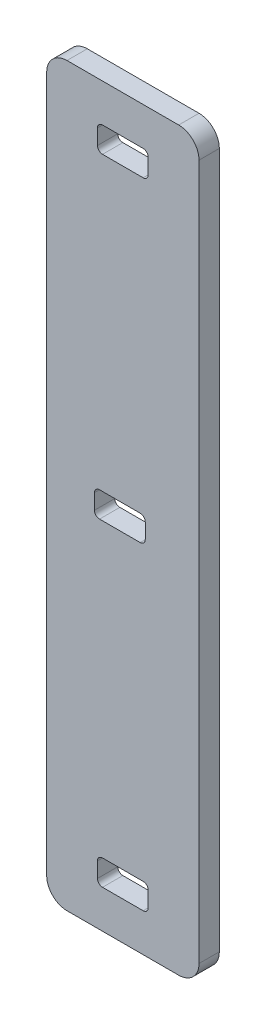
ISO-10303-21;
HEADER;
FILE_DESCRIPTION(('STEP AP214'),'2;1');
FILE_NAME('part.step','',(''),(''),'','','');
FILE_SCHEMA(('AUTOMOTIVE_DESIGN { 1 0 10303 214 1 1 1 1 }'));
ENDSEC;
DATA;
#1=APPLICATION_CONTEXT('core data for automotive mechanical design processes');
#2=APPLICATION_PROTOCOL_DEFINITION('international standard','automotive_design',2000,#1);
#3=PRODUCT_CONTEXT('',#1,'mechanical');
#4=PRODUCT('Part','Part','',(#3));
#5=PRODUCT_RELATED_PRODUCT_CATEGORY('part','',(#4));
#6=PRODUCT_DEFINITION_FORMATION('','',#4);
#7=PRODUCT_DEFINITION_CONTEXT('part definition',#1,'design');
#8=PRODUCT_DEFINITION('design','',#6,#7);
#9=PRODUCT_DEFINITION_SHAPE('','',#8);
#10=(LENGTH_UNIT() NAMED_UNIT(*) SI_UNIT(.MILLI.,.METRE.));
#11=(NAMED_UNIT(*) PLANE_ANGLE_UNIT() SI_UNIT($,.RADIAN.));
#12=(NAMED_UNIT(*) SI_UNIT($,.STERADIAN.) SOLID_ANGLE_UNIT());
#13=UNCERTAINTY_MEASURE_WITH_UNIT(LENGTH_MEASURE(1.E-05),#10,'distance_accuracy_value','');
#14=(GEOMETRIC_REPRESENTATION_CONTEXT(3) GLOBAL_UNCERTAINTY_ASSIGNED_CONTEXT((#13)) GLOBAL_UNIT_ASSIGNED_CONTEXT((#10,
#11,#12)) REPRESENTATION_CONTEXT('',''));
#15=CARTESIAN_POINT('',(0.,0.,0.));
#16=DIRECTION('',(0.,0.,1.));
#17=DIRECTION('',(1.,0.,0.));
#18=AXIS2_PLACEMENT_3D('',#15,#16,#17);
#19=CARTESIAN_POINT('',(-11.,-68.5,4.));
#20=DIRECTION('',(0.,0.,-1.));
#21=DIRECTION('',(-1.,0.,0.));
#22=AXIS2_PLACEMENT_3D('',#19,#20,#21);
#23=CYLINDRICAL_SURFACE('',#22,4.);
#24=CARTESIAN_POINT('',(-11.,-68.5,0.));
#25=DIRECTION('',(0.,0.,1.));
#26=DIRECTION('',(-1.,0.,0.));
#27=AXIS2_PLACEMENT_3D('',#24,#25,#26);
#28=CIRCLE('',#27,4.);
#29=CARTESIAN_POINT('',(-15.,-68.5,0.));
#30=VERTEX_POINT('',#29);
#31=CARTESIAN_POINT('',(-11.,-72.5,0.));
#32=VERTEX_POINT('',#31);
#33=EDGE_CURVE('E304',#30,#32,#28,.T.);
#34=ORIENTED_EDGE('',*,*,#33,.T.);
#35=DIRECTION('',(0.,0.,-1.));
#36=VECTOR('',#35,1.);
#37=CARTESIAN_POINT('',(-11.,-72.5,4.));
#38=LINE('',#37,#36);
#39=CARTESIAN_POINT('',(-11.,-72.5,4.));
#40=VERTEX_POINT('',#39);
#41=EDGE_CURVE('E11',#40,#32,#38,.T.);
#42=ORIENTED_EDGE('',*,*,#41,.F.);
#43=CARTESIAN_POINT('',(-11.,-68.5,4.));
#44=DIRECTION('',(0.,0.,1.));
#45=DIRECTION('',(-1.,0.,0.));
#46=AXIS2_PLACEMENT_3D('',#43,#44,#45);
#47=CIRCLE('',#46,4.);
#48=CARTESIAN_POINT('',(-15.,-68.5,4.));
#49=VERTEX_POINT('',#48);
#50=EDGE_CURVE('E441',#49,#40,#47,.T.);
#51=ORIENTED_EDGE('',*,*,#50,.F.);
#52=DIRECTION('',(0.,0.,-1.));
#53=VECTOR('',#52,1.);
#54=CARTESIAN_POINT('',(-15.,-68.5,4.));
#55=LINE('',#54,#53);
#56=EDGE_CURVE('E459',#49,#30,#55,.T.);
#57=ORIENTED_EDGE('',*,*,#56,.T.);
#58=EDGE_LOOP('',(#34,#42,#51,#57));
#59=FACE_BOUND('',#58,.T.);
#60=ADVANCED_FACE('F35',(#59),#23,.T.);
#61=CARTESIAN_POINT('',(-11.,-72.5,4.));
#62=DIRECTION('',(0.,1.,0.));
#63=DIRECTION('',(0.,0.,1.));
#64=AXIS2_PLACEMENT_3D('',#61,#62,#63);
#65=PLANE('',#64);
#66=DIRECTION('',(1.,0.,0.));
#67=VECTOR('',#66,1.);
#68=CARTESIAN_POINT('',(-11.,-72.5,0.));
#69=LINE('',#68,#67);
#70=CARTESIAN_POINT('',(11.,-72.5,0.));
#71=VERTEX_POINT('',#70);
#72=EDGE_CURVE('E462',#32,#71,#69,.T.);
#73=ORIENTED_EDGE('',*,*,#72,.T.);
#74=DIRECTION('',(0.,0.,-1.));
#75=VECTOR('',#74,1.);
#76=CARTESIAN_POINT('',(11.,-72.5,4.));
#77=LINE('',#76,#75);
#78=CARTESIAN_POINT('',(11.,-72.5,4.));
#79=VERTEX_POINT('',#78);
#80=EDGE_CURVE('E42',#79,#71,#77,.T.);
#81=ORIENTED_EDGE('',*,*,#80,.F.);
#82=DIRECTION('',(1.,0.,0.));
#83=VECTOR('',#82,1.);
#84=CARTESIAN_POINT('',(-11.,-72.5,4.));
#85=LINE('',#84,#83);
#86=EDGE_CURVE('E444',#40,#79,#85,.T.);
#87=ORIENTED_EDGE('',*,*,#86,.F.);
#88=ORIENTED_EDGE('',*,*,#41,.T.);
#89=EDGE_LOOP('',(#73,#81,#87,#88));
#90=FACE_BOUND('',#89,.T.);
#91=ADVANCED_FACE('F518',(#90),#65,.F.);
#92=CARTESIAN_POINT('',(11.,-68.5,4.));
#93=DIRECTION('',(0.,0.,-1.));
#94=DIRECTION('',(-1.,0.,0.));
#95=AXIS2_PLACEMENT_3D('',#92,#93,#94);
#96=CYLINDRICAL_SURFACE('',#95,4.);
#97=CARTESIAN_POINT('',(11.,-68.5,0.));
#98=DIRECTION('',(0.,0.,1.));
#99=DIRECTION('',(1.,0.,0.));
#100=AXIS2_PLACEMENT_3D('',#97,#98,#99);
#101=CIRCLE('',#100,4.);
#102=CARTESIAN_POINT('',(15.,-68.5,0.));
#103=VERTEX_POINT('',#102);
#104=EDGE_CURVE('E464',#71,#103,#101,.T.);
#105=ORIENTED_EDGE('',*,*,#104,.T.);
#106=DIRECTION('',(0.,0.,-1.));
#107=VECTOR('',#106,1.);
#108=CARTESIAN_POINT('',(15.,-68.5,4.));
#109=LINE('',#108,#107);
#110=CARTESIAN_POINT('',(15.,-68.5,4.));
#111=VERTEX_POINT('',#110);
#112=EDGE_CURVE('E489',#111,#103,#109,.T.);
#113=ORIENTED_EDGE('',*,*,#112,.F.);
#114=CARTESIAN_POINT('',(11.,-68.5,4.));
#115=DIRECTION('',(0.,0.,1.));
#116=DIRECTION('',(1.,0.,0.));
#117=AXIS2_PLACEMENT_3D('',#114,#115,#116);
#118=CIRCLE('',#117,4.);
#119=EDGE_CURVE('E447',#79,#111,#118,.T.);
#120=ORIENTED_EDGE('',*,*,#119,.F.);
#121=ORIENTED_EDGE('',*,*,#80,.T.);
#122=EDGE_LOOP('',(#105,#113,#120,#121));
#123=FACE_BOUND('',#122,.T.);
#124=ADVANCED_FACE('F496',(#123),#96,.T.);
#125=CARTESIAN_POINT('',(15.,-68.5,4.));
#126=DIRECTION('',(-1.,0.,0.));
#127=DIRECTION('',(0.,0.,1.));
#128=AXIS2_PLACEMENT_3D('',#125,#126,#127);
#129=PLANE('',#128);
#130=DIRECTION('',(0.,1.,0.));
#131=VECTOR('',#130,1.);
#132=CARTESIAN_POINT('',(15.,-68.5,0.));
#133=LINE('',#132,#131);
#134=CARTESIAN_POINT('',(15.,68.5,0.));
#135=VERTEX_POINT('',#134);
#136=EDGE_CURVE('E466',#103,#135,#133,.T.);
#137=ORIENTED_EDGE('',*,*,#136,.T.);
#138=DIRECTION('',(0.,0.,-1.));
#139=VECTOR('',#138,1.);
#140=CARTESIAN_POINT('',(15.,68.5,4.));
#141=LINE('',#140,#139);
#142=CARTESIAN_POINT('',(15.,68.5,4.));
#143=VERTEX_POINT('',#142);
#144=EDGE_CURVE('E486',#143,#135,#141,.T.);
#145=ORIENTED_EDGE('',*,*,#144,.F.);
#146=DIRECTION('',(0.,1.,0.));
#147=VECTOR('',#146,1.);
#148=CARTESIAN_POINT('',(15.,-68.5,4.));
#149=LINE('',#148,#147);
#150=EDGE_CURVE('E449',#111,#143,#149,.T.);
#151=ORIENTED_EDGE('',*,*,#150,.F.);
#152=ORIENTED_EDGE('',*,*,#112,.T.);
#153=EDGE_LOOP('',(#137,#145,#151,#152));
#154=FACE_BOUND('',#153,.T.);
#155=ADVANCED_FACE('F506',(#154),#129,.F.);
#156=CARTESIAN_POINT('',(11.,68.5,4.));
#157=DIRECTION('',(0.,0.,-1.));
#158=DIRECTION('',(-1.,0.,0.));
#159=AXIS2_PLACEMENT_3D('',#156,#157,#158);
#160=CYLINDRICAL_SURFACE('',#159,4.);
#161=CARTESIAN_POINT('',(11.,68.5,0.));
#162=DIRECTION('',(0.,0.,1.));
#163=DIRECTION('',(-1.,0.,0.));
#164=AXIS2_PLACEMENT_3D('',#161,#162,#163);
#165=CIRCLE('',#164,4.);
#166=CARTESIAN_POINT('',(11.,72.5,0.));
#167=VERTEX_POINT('',#166);
#168=EDGE_CURVE('E468',#135,#167,#165,.T.);
#169=ORIENTED_EDGE('',*,*,#168,.T.);
#170=DIRECTION('',(0.,0.,-1.));
#171=VECTOR('',#170,1.);
#172=CARTESIAN_POINT('',(11.,72.5,4.));
#173=LINE('',#172,#171);
#174=CARTESIAN_POINT('',(11.,72.5,4.));
#175=VERTEX_POINT('',#174);
#176=EDGE_CURVE('E483',#175,#167,#173,.T.);
#177=ORIENTED_EDGE('',*,*,#176,.F.);
#178=CARTESIAN_POINT('',(11.,68.5,4.));
#179=DIRECTION('',(0.,0.,1.));
#180=DIRECTION('',(-1.,0.,0.));
#181=AXIS2_PLACEMENT_3D('',#178,#179,#180);
#182=CIRCLE('',#181,4.);
#183=EDGE_CURVE('E451',#143,#175,#182,.T.);
#184=ORIENTED_EDGE('',*,*,#183,.F.);
#185=ORIENTED_EDGE('',*,*,#144,.T.);
#186=EDGE_LOOP('',(#169,#177,#184,#185));
#187=FACE_BOUND('',#186,.T.);
#188=ADVANCED_FACE('F510',(#187),#160,.T.);
#189=CARTESIAN_POINT('',(-11.,72.5,4.));
#190=DIRECTION('',(0.,-1.,0.));
#191=DIRECTION('',(0.,0.,-1.));
#192=AXIS2_PLACEMENT_3D('',#189,#190,#191);
#193=PLANE('',#192);
#194=DIRECTION('',(-1.,0.,0.));
#195=VECTOR('',#194,1.);
#196=CARTESIAN_POINT('',(-11.,72.5,0.));
#197=LINE('',#196,#195);
#198=CARTESIAN_POINT('',(-11.,72.5,0.));
#199=VERTEX_POINT('',#198);
#200=EDGE_CURVE('E470',#167,#199,#197,.T.);
#201=ORIENTED_EDGE('',*,*,#200,.T.);
#202=DIRECTION('',(0.,0.,-1.));
#203=VECTOR('',#202,1.);
#204=CARTESIAN_POINT('',(-11.,72.5,4.));
#205=LINE('',#204,#203);
#206=CARTESIAN_POINT('',(-11.,72.5,4.));
#207=VERTEX_POINT('',#206);
#208=EDGE_CURVE('E480',#207,#199,#205,.T.);
#209=ORIENTED_EDGE('',*,*,#208,.F.);
#210=DIRECTION('',(-1.,0.,0.));
#211=VECTOR('',#210,1.);
#212=CARTESIAN_POINT('',(-11.,72.5,4.));
#213=LINE('',#212,#211);
#214=EDGE_CURVE('E453',#175,#207,#213,.T.);
#215=ORIENTED_EDGE('',*,*,#214,.F.);
#216=ORIENTED_EDGE('',*,*,#176,.T.);
#217=EDGE_LOOP('',(#201,#209,#215,#216));
#218=FACE_BOUND('',#217,.T.);
#219=ADVANCED_FACE('F531',(#218),#193,.F.);
#220=CARTESIAN_POINT('',(-11.,68.5,4.));
#221=DIRECTION('',(0.,0.,-1.));
#222=DIRECTION('',(-1.,0.,0.));
#223=AXIS2_PLACEMENT_3D('',#220,#221,#222);
#224=CYLINDRICAL_SURFACE('',#223,4.);
#225=CARTESIAN_POINT('',(-11.,68.5,0.));
#226=DIRECTION('',(0.,0.,1.));
#227=DIRECTION('',(-1.,0.,0.));
#228=AXIS2_PLACEMENT_3D('',#225,#226,#227);
#229=CIRCLE('',#228,4.);
#230=CARTESIAN_POINT('',(-15.,68.5,0.));
#231=VERTEX_POINT('',#230);
#232=EDGE_CURVE('E472',#199,#231,#229,.T.);
#233=ORIENTED_EDGE('',*,*,#232,.T.);
#234=DIRECTION('',(0.,0.,-1.));
#235=VECTOR('',#234,1.);
#236=CARTESIAN_POINT('',(-15.,68.5,4.));
#237=LINE('',#236,#235);
#238=CARTESIAN_POINT('',(-15.,68.5,4.));
#239=VERTEX_POINT('',#238);
#240=EDGE_CURVE('E477',#239,#231,#237,.T.);
#241=ORIENTED_EDGE('',*,*,#240,.F.);
#242=CARTESIAN_POINT('',(-11.,68.5,4.));
#243=DIRECTION('',(0.,0.,1.));
#244=DIRECTION('',(-1.,0.,0.));
#245=AXIS2_PLACEMENT_3D('',#242,#243,#244);
#246=CIRCLE('',#245,4.);
#247=EDGE_CURVE('E455',#207,#239,#246,.T.);
#248=ORIENTED_EDGE('',*,*,#247,.F.);
#249=ORIENTED_EDGE('',*,*,#208,.T.);
#250=EDGE_LOOP('',(#233,#241,#248,#249));
#251=FACE_BOUND('',#250,.T.);
#252=ADVANCED_FACE('F529',(#251),#224,.T.);
#253=CARTESIAN_POINT('',(-15.,-68.5,4.));
#254=DIRECTION('',(1.,0.,0.));
#255=DIRECTION('',(0.,0.,-1.));
#256=AXIS2_PLACEMENT_3D('',#253,#254,#255);
#257=PLANE('',#256);
#258=DIRECTION('',(0.,-1.,0.));
#259=VECTOR('',#258,1.);
#260=CARTESIAN_POINT('',(-15.,-68.5,0.));
#261=LINE('',#260,#259);
#262=EDGE_CURVE('E445',#231,#30,#261,.T.);
#263=ORIENTED_EDGE('',*,*,#262,.T.);
#264=ORIENTED_EDGE('',*,*,#56,.F.);
#265=DIRECTION('',(0.,-1.,0.));
#266=VECTOR('',#265,1.);
#267=CARTESIAN_POINT('',(-15.,-68.5,4.));
#268=LINE('',#267,#266);
#269=EDGE_CURVE('E457',#239,#49,#268,.T.);
#270=ORIENTED_EDGE('',*,*,#269,.F.);
#271=ORIENTED_EDGE('',*,*,#240,.T.);
#272=EDGE_LOOP('',(#263,#264,#270,#271));
#273=FACE_BOUND('',#272,.T.);
#274=ADVANCED_FACE('F524',(#273),#257,.F.);
#275=CARTESIAN_POINT('',(-11.,-68.5,4.));
#276=DIRECTION('',(0.,0.,-1.));
#277=DIRECTION('',(-1.,0.,0.));
#278=AXIS2_PLACEMENT_3D('',#275,#276,#277);
#279=PLANE('',#278);
#280=DIRECTION('',(0.,-1.,0.));
#281=VECTOR('',#280,1.);
#282=CARTESIAN_POINT('',(-4.99999999999998,64.,4.));
#283=LINE('',#282,#281);
#284=CARTESIAN_POINT('',(-4.99999999999998,64.,4.));
#285=VERTEX_POINT('',#284);
#286=CARTESIAN_POINT('',(-4.99999999999998,61.,4.));
#287=VERTEX_POINT('',#286);
#288=EDGE_CURVE('E285',#285,#287,#283,.T.);
#289=ORIENTED_EDGE('',*,*,#288,.F.);
#290=CARTESIAN_POINT('',(-3.99999999999998,64.,4.));
#291=DIRECTION('',(0.,0.,1.));
#292=DIRECTION('',(1.,0.,0.));
#293=AXIS2_PLACEMENT_3D('',#290,#291,#292);
#294=CIRCLE('',#293,1.);
#295=CARTESIAN_POINT('',(-3.99999999999998,65.,4.));
#296=VERTEX_POINT('',#295);
#297=EDGE_CURVE('E49',#296,#285,#294,.T.);
#298=ORIENTED_EDGE('',*,*,#297,.F.);
#299=DIRECTION('',(-1.,0.,0.));
#300=VECTOR('',#299,1.);
#301=CARTESIAN_POINT('',(-3.99999999999998,65.,4.));
#302=LINE('',#301,#300);
#303=CARTESIAN_POINT('',(4.00000000000002,65.,4.));
#304=VERTEX_POINT('',#303);
#305=EDGE_CURVE('E265',#304,#296,#302,.T.);
#306=ORIENTED_EDGE('',*,*,#305,.F.);
#307=CARTESIAN_POINT('',(4.00000000000002,64.,4.));
#308=DIRECTION('',(0.,0.,1.));
#309=DIRECTION('',(-1.,0.,0.));
#310=AXIS2_PLACEMENT_3D('',#307,#308,#309);
#311=CIRCLE('',#310,1.);
#312=CARTESIAN_POINT('',(5.00000000000002,64.,4.));
#313=VERTEX_POINT('',#312);
#314=EDGE_CURVE('E268',#313,#304,#311,.T.);
#315=ORIENTED_EDGE('',*,*,#314,.F.);
#316=DIRECTION('',(0.,1.,0.));
#317=VECTOR('',#316,1.);
#318=CARTESIAN_POINT('',(5.00000000000002,64.,4.));
#319=LINE('',#318,#317);
#320=CARTESIAN_POINT('',(5.00000000000002,61.,4.));
#321=VERTEX_POINT('',#320);
#322=EDGE_CURVE('E297',#321,#313,#319,.T.);
#323=ORIENTED_EDGE('',*,*,#322,.F.);
#324=CARTESIAN_POINT('',(4.00000000000002,61.,4.));
#325=DIRECTION('',(0.,0.,1.));
#326=DIRECTION('',(1.,0.,0.));
#327=AXIS2_PLACEMENT_3D('',#324,#325,#326);
#328=CIRCLE('',#327,1.);
#329=CARTESIAN_POINT('',(4.00000000000002,60.,4.));
#330=VERTEX_POINT('',#329);
#331=EDGE_CURVE('E294',#330,#321,#328,.T.);
#332=ORIENTED_EDGE('',*,*,#331,.F.);
#333=DIRECTION('',(1.,0.,0.));
#334=VECTOR('',#333,1.);
#335=CARTESIAN_POINT('',(-3.99999999999998,60.,4.));
#336=LINE('',#335,#334);
#337=CARTESIAN_POINT('',(-3.99999999999998,60.,4.));
#338=VERTEX_POINT('',#337);
#339=EDGE_CURVE('E291',#338,#330,#336,.T.);
#340=ORIENTED_EDGE('',*,*,#339,.F.);
#341=CARTESIAN_POINT('',(-3.99999999999998,61.,4.));
#342=DIRECTION('',(0.,0.,1.));
#343=DIRECTION('',(1.,0.,0.));
#344=AXIS2_PLACEMENT_3D('',#341,#342,#343);
#345=CIRCLE('',#344,1.);
#346=EDGE_CURVE('E288',#287,#338,#345,.T.);
#347=ORIENTED_EDGE('',*,*,#346,.F.);
#348=EDGE_LOOP('',(#289,#298,#306,#315,#323,#332,#340,#347));
#349=FACE_BOUND('',#348,.T.);
#350=DIRECTION('',(0.,-1.,0.));
#351=VECTOR('',#350,1.);
#352=CARTESIAN_POINT('',(-5.00000000000003,-61.,4.));
#353=LINE('',#352,#351);
#354=CARTESIAN_POINT('',(-5.00000000000003,-61.,4.));
#355=VERTEX_POINT('',#354);
#356=CARTESIAN_POINT('',(-5.00000000000003,-64.,4.));
#357=VERTEX_POINT('',#356);
#358=EDGE_CURVE('E343',#355,#357,#353,.T.);
#359=ORIENTED_EDGE('',*,*,#358,.F.);
#360=CARTESIAN_POINT('',(-4.00000000000003,-61.,4.));
#361=DIRECTION('',(0.,0.,1.));
#362=DIRECTION('',(1.,0.,0.));
#363=AXIS2_PLACEMENT_3D('',#360,#361,#362);
#364=CIRCLE('',#363,1.);
#365=CARTESIAN_POINT('',(-4.00000000000003,-60.,4.));
#366=VERTEX_POINT('',#365);
#367=EDGE_CURVE('E57',#366,#355,#364,.T.);
#368=ORIENTED_EDGE('',*,*,#367,.F.);
#369=DIRECTION('',(-1.,0.,0.));
#370=VECTOR('',#369,1.);
#371=CARTESIAN_POINT('',(-4.00000000000003,-60.,4.));
#372=LINE('',#371,#370);
#373=CARTESIAN_POINT('',(3.99999999999997,-60.,4.));
#374=VERTEX_POINT('',#373);
#375=EDGE_CURVE('E320',#374,#366,#372,.T.);
#376=ORIENTED_EDGE('',*,*,#375,.F.);
#377=CARTESIAN_POINT('',(3.99999999999997,-61.,4.));
#378=DIRECTION('',(0.,0.,1.));
#379=DIRECTION('',(-1.,0.,0.));
#380=AXIS2_PLACEMENT_3D('',#377,#378,#379);
#381=CIRCLE('',#380,1.);
#382=CARTESIAN_POINT('',(4.99999999999997,-61.,4.));
#383=VERTEX_POINT('',#382);
#384=EDGE_CURVE('E359',#383,#374,#381,.T.);
#385=ORIENTED_EDGE('',*,*,#384,.F.);
#386=DIRECTION('',(0.,1.,0.));
#387=VECTOR('',#386,1.);
#388=CARTESIAN_POINT('',(4.99999999999997,-61.,4.));
#389=LINE('',#388,#387);
#390=CARTESIAN_POINT('',(4.99999999999997,-64.,4.));
#391=VERTEX_POINT('',#390);
#392=EDGE_CURVE('E356',#391,#383,#389,.T.);
#393=ORIENTED_EDGE('',*,*,#392,.F.);
#394=CARTESIAN_POINT('',(3.99999999999997,-64.,4.));
#395=DIRECTION('',(0.,0.,1.));
#396=DIRECTION('',(1.,0.,0.));
#397=AXIS2_PLACEMENT_3D('',#394,#395,#396);
#398=CIRCLE('',#397,1.);
#399=CARTESIAN_POINT('',(3.99999999999997,-65.,4.));
#400=VERTEX_POINT('',#399);
#401=EDGE_CURVE('E353',#400,#391,#398,.T.);
#402=ORIENTED_EDGE('',*,*,#401,.F.);
#403=DIRECTION('',(1.,0.,0.));
#404=VECTOR('',#403,1.);
#405=CARTESIAN_POINT('',(-4.00000000000003,-65.,4.));
#406=LINE('',#405,#404);
#407=CARTESIAN_POINT('',(-4.00000000000003,-65.,4.));
#408=VERTEX_POINT('',#407);
#409=EDGE_CURVE('E350',#408,#400,#406,.T.);
#410=ORIENTED_EDGE('',*,*,#409,.F.);
#411=CARTESIAN_POINT('',(-4.00000000000003,-64.,4.));
#412=DIRECTION('',(0.,0.,1.));
#413=DIRECTION('',(1.,0.,0.));
#414=AXIS2_PLACEMENT_3D('',#411,#412,#413);
#415=CIRCLE('',#414,1.);
#416=EDGE_CURVE('E347',#357,#408,#415,.T.);
#417=ORIENTED_EDGE('',*,*,#416,.F.);
#418=EDGE_LOOP('',(#359,#368,#376,#385,#393,#402,#410,#417));
#419=FACE_BOUND('',#418,.T.);
#420=DIRECTION('',(0.,-1.,0.));
#421=VECTOR('',#420,1.);
#422=CARTESIAN_POINT('',(-5.58762243909685,1.49999999999998,4.));
#423=LINE('',#422,#421);
#424=CARTESIAN_POINT('',(-5.58762243909685,1.49999999999999,4.));
#425=VERTEX_POINT('',#424);
#426=CARTESIAN_POINT('',(-5.58762243909685,-1.50000000000002,4.));
#427=VERTEX_POINT('',#426);
#428=EDGE_CURVE('E406',#425,#427,#423,.T.);
#429=ORIENTED_EDGE('',*,*,#428,.F.);
#430=CARTESIAN_POINT('',(-4.58762243909685,1.49999999999998,4.));
#431=DIRECTION('',(0.,0.,1.));
#432=DIRECTION('',(1.,0.,0.));
#433=AXIS2_PLACEMENT_3D('',#430,#431,#432);
#434=CIRCLE('',#433,1.);
#435=CARTESIAN_POINT('',(-4.58762243909685,2.49999999999998,4.));
#436=VERTEX_POINT('',#435);
#437=EDGE_CURVE('E404',#436,#425,#434,.T.);
#438=ORIENTED_EDGE('',*,*,#437,.F.);
#439=DIRECTION('',(-1.,0.,0.));
#440=VECTOR('',#439,1.);
#441=CARTESIAN_POINT('',(-4.58762243909685,2.49999999999998,4.));
#442=LINE('',#441,#440);
#443=CARTESIAN_POINT('',(3.41237756090315,2.49999999999998,4.));
#444=VERTEX_POINT('',#443);
#445=EDGE_CURVE('E382',#444,#436,#442,.T.);
#446=ORIENTED_EDGE('',*,*,#445,.F.);
#447=CARTESIAN_POINT('',(3.41237756090315,1.49999999999998,4.));
#448=DIRECTION('',(0.,0.,1.));
#449=DIRECTION('',(-1.,0.,0.));
#450=AXIS2_PLACEMENT_3D('',#447,#448,#449);
#451=CIRCLE('',#450,1.);
#452=CARTESIAN_POINT('',(4.41237756090315,1.49999999999998,4.));
#453=VERTEX_POINT('',#452);
#454=EDGE_CURVE('E421',#453,#444,#451,.T.);
#455=ORIENTED_EDGE('',*,*,#454,.F.);
#456=DIRECTION('',(0.,1.,0.));
#457=VECTOR('',#456,1.);
#458=CARTESIAN_POINT('',(4.41237756090315,1.49999999999998,4.));
#459=LINE('',#458,#457);
#460=CARTESIAN_POINT('',(4.41237756090315,-1.50000000000002,4.));
#461=VERTEX_POINT('',#460);
#462=EDGE_CURVE('E418',#461,#453,#459,.T.);
#463=ORIENTED_EDGE('',*,*,#462,.F.);
#464=CARTESIAN_POINT('',(3.41237756090315,-1.50000000000002,4.));
#465=DIRECTION('',(0.,0.,1.));
#466=DIRECTION('',(1.,0.,0.));
#467=AXIS2_PLACEMENT_3D('',#464,#465,#466);
#468=CIRCLE('',#467,1.);
#469=CARTESIAN_POINT('',(3.41237756090315,-2.50000000000002,4.));
#470=VERTEX_POINT('',#469);
#471=EDGE_CURVE('E415',#470,#461,#468,.T.);
#472=ORIENTED_EDGE('',*,*,#471,.F.);
#473=DIRECTION('',(1.,0.,0.));
#474=VECTOR('',#473,1.);
#475=CARTESIAN_POINT('',(-4.58762243909685,-2.50000000000002,4.));
#476=LINE('',#475,#474);
#477=CARTESIAN_POINT('',(-4.58762243909685,-2.50000000000002,4.));
#478=VERTEX_POINT('',#477);
#479=EDGE_CURVE('E412',#478,#470,#476,.T.);
#480=ORIENTED_EDGE('',*,*,#479,.F.);
#481=CARTESIAN_POINT('',(-4.58762243909685,-1.50000000000002,4.));
#482=DIRECTION('',(0.,0.,1.));
#483=DIRECTION('',(1.,0.,0.));
#484=AXIS2_PLACEMENT_3D('',#481,#482,#483);
#485=CIRCLE('',#484,0.999999999999999);
#486=EDGE_CURVE('E409',#427,#478,#485,.T.);
#487=ORIENTED_EDGE('',*,*,#486,.F.);
#488=EDGE_LOOP('',(#429,#438,#446,#455,#463,#472,#480,#487));
#489=FACE_BOUND('',#488,.T.);
#490=ORIENTED_EDGE('',*,*,#50,.T.);
#491=ORIENTED_EDGE('',*,*,#86,.T.);
#492=ORIENTED_EDGE('',*,*,#119,.T.);
#493=ORIENTED_EDGE('',*,*,#150,.T.);
#494=ORIENTED_EDGE('',*,*,#183,.T.);
#495=ORIENTED_EDGE('',*,*,#214,.T.);
#496=ORIENTED_EDGE('',*,*,#247,.T.);
#497=ORIENTED_EDGE('',*,*,#269,.T.);
#498=EDGE_LOOP('',(#490,#491,#492,#493,#494,#495,#496,#497));
#499=FACE_BOUND('',#498,.T.);
#500=ADVANCED_FACE('F514',(#349,#419,#489,#499),#279,.F.);
#501=CARTESIAN_POINT('',(-11.,-68.5,0.));
#502=DIRECTION('',(0.,0.,-1.));
#503=DIRECTION('',(-1.,0.,0.));
#504=AXIS2_PLACEMENT_3D('',#501,#502,#503);
#505=PLANE('',#504);
#506=CARTESIAN_POINT('',(-3.99999999999998,64.,0.));
#507=DIRECTION('',(0.,0.,1.));
#508=DIRECTION('',(1.,0.,0.));
#509=AXIS2_PLACEMENT_3D('',#506,#507,#508);
#510=CIRCLE('',#509,1.);
#511=CARTESIAN_POINT('',(-3.99999999999998,65.,0.));
#512=VERTEX_POINT('',#511);
#513=CARTESIAN_POINT('',(-4.99999999999998,64.,0.));
#514=VERTEX_POINT('',#513);
#515=EDGE_CURVE('E245',#512,#514,#510,.T.);
#516=ORIENTED_EDGE('',*,*,#515,.T.);
#517=DIRECTION('',(0.,-1.,0.));
#518=VECTOR('',#517,1.);
#519=CARTESIAN_POINT('',(-4.99999999999998,64.,0.));
#520=LINE('',#519,#518);
#521=CARTESIAN_POINT('',(-4.99999999999998,61.,0.));
#522=VERTEX_POINT('',#521);
#523=EDGE_CURVE('E255',#514,#522,#520,.T.);
#524=ORIENTED_EDGE('',*,*,#523,.T.);
#525=CARTESIAN_POINT('',(-3.99999999999998,61.,0.));
#526=DIRECTION('',(0.,0.,1.));
#527=DIRECTION('',(1.,0.,0.));
#528=AXIS2_PLACEMENT_3D('',#525,#526,#527);
#529=CIRCLE('',#528,1.);
#530=CARTESIAN_POINT('',(-3.99999999999998,60.,0.));
#531=VERTEX_POINT('',#530);
#532=EDGE_CURVE('E259',#522,#531,#529,.T.);
#533=ORIENTED_EDGE('',*,*,#532,.T.);
#534=DIRECTION('',(1.,0.,0.));
#535=VECTOR('',#534,1.);
#536=CARTESIAN_POINT('',(-3.99999999999998,60.,0.));
#537=LINE('',#536,#535);
#538=CARTESIAN_POINT('',(4.00000000000002,60.,0.));
#539=VERTEX_POINT('',#538);
#540=EDGE_CURVE('E272',#531,#539,#537,.T.);
#541=ORIENTED_EDGE('',*,*,#540,.T.);
#542=CARTESIAN_POINT('',(4.00000000000002,61.,0.));
#543=DIRECTION('',(0.,0.,1.));
#544=DIRECTION('',(1.,0.,0.));
#545=AXIS2_PLACEMENT_3D('',#542,#543,#544);
#546=CIRCLE('',#545,1.);
#547=CARTESIAN_POINT('',(5.00000000000002,61.,0.));
#548=VERTEX_POINT('',#547);
#549=EDGE_CURVE('E275',#539,#548,#546,.T.);
#550=ORIENTED_EDGE('',*,*,#549,.T.);
#551=DIRECTION('',(0.,1.,0.));
#552=VECTOR('',#551,1.);
#553=CARTESIAN_POINT('',(5.00000000000002,64.,0.));
#554=LINE('',#553,#552);
#555=CARTESIAN_POINT('',(5.00000000000002,64.,0.));
#556=VERTEX_POINT('',#555);
#557=EDGE_CURVE('E278',#548,#556,#554,.T.);
#558=ORIENTED_EDGE('',*,*,#557,.T.);
#559=CARTESIAN_POINT('',(4.00000000000002,64.,0.));
#560=DIRECTION('',(0.,0.,1.));
#561=DIRECTION('',(-1.,0.,0.));
#562=AXIS2_PLACEMENT_3D('',#559,#560,#561);
#563=CIRCLE('',#562,1.);
#564=CARTESIAN_POINT('',(4.00000000000002,65.,0.));
#565=VERTEX_POINT('',#564);
#566=EDGE_CURVE('E281',#556,#565,#563,.T.);
#567=ORIENTED_EDGE('',*,*,#566,.T.);
#568=DIRECTION('',(-1.,0.,0.));
#569=VECTOR('',#568,1.);
#570=CARTESIAN_POINT('',(-3.99999999999998,65.,0.));
#571=LINE('',#570,#569);
#572=EDGE_CURVE('E251',#565,#512,#571,.T.);
#573=ORIENTED_EDGE('',*,*,#572,.T.);
#574=EDGE_LOOP('',(#516,#524,#533,#541,#550,#558,#567,#573));
#575=FACE_BOUND('',#574,.T.);
#576=CARTESIAN_POINT('',(-4.00000000000003,-61.,0.));
#577=DIRECTION('',(0.,0.,1.));
#578=DIRECTION('',(1.,0.,0.));
#579=AXIS2_PLACEMENT_3D('',#576,#577,#578);
#580=CIRCLE('',#579,1.);
#581=CARTESIAN_POINT('',(-4.00000000000003,-60.,0.));
#582=VERTEX_POINT('',#581);
#583=CARTESIAN_POINT('',(-5.00000000000003,-61.,0.));
#584=VERTEX_POINT('',#583);
#585=EDGE_CURVE('E316',#582,#584,#580,.T.);
#586=ORIENTED_EDGE('',*,*,#585,.T.);
#587=DIRECTION('',(0.,-1.,0.));
#588=VECTOR('',#587,1.);
#589=CARTESIAN_POINT('',(-5.00000000000003,-61.,0.));
#590=LINE('',#589,#588);
#591=CARTESIAN_POINT('',(-5.00000000000003,-64.,0.));
#592=VERTEX_POINT('',#591);
#593=EDGE_CURVE('E319',#584,#592,#590,.T.);
#594=ORIENTED_EDGE('',*,*,#593,.T.);
#595=CARTESIAN_POINT('',(-4.00000000000003,-64.,0.));
#596=DIRECTION('',(0.,0.,1.));
#597=DIRECTION('',(1.,0.,0.));
#598=AXIS2_PLACEMENT_3D('',#595,#596,#597);
#599=CIRCLE('',#598,1.);
#600=CARTESIAN_POINT('',(-4.00000000000003,-65.,0.));
#601=VERTEX_POINT('',#600);
#602=EDGE_CURVE('E323',#592,#601,#599,.T.);
#603=ORIENTED_EDGE('',*,*,#602,.T.);
#604=DIRECTION('',(1.,0.,0.));
#605=VECTOR('',#604,1.);
#606=CARTESIAN_POINT('',(-4.00000000000003,-65.,0.));
#607=LINE('',#606,#605);
#608=CARTESIAN_POINT('',(3.99999999999997,-65.,0.));
#609=VERTEX_POINT('',#608);
#610=EDGE_CURVE('E326',#601,#609,#607,.T.);
#611=ORIENTED_EDGE('',*,*,#610,.T.);
#612=CARTESIAN_POINT('',(3.99999999999997,-64.,0.));
#613=DIRECTION('',(0.,0.,1.));
#614=DIRECTION('',(1.,0.,0.));
#615=AXIS2_PLACEMENT_3D('',#612,#613,#614);
#616=CIRCLE('',#615,1.);
#617=CARTESIAN_POINT('',(4.99999999999997,-64.,0.));
#618=VERTEX_POINT('',#617);
#619=EDGE_CURVE('E329',#609,#618,#616,.T.);
#620=ORIENTED_EDGE('',*,*,#619,.T.);
#621=DIRECTION('',(0.,1.,0.));
#622=VECTOR('',#621,1.);
#623=CARTESIAN_POINT('',(4.99999999999997,-61.,0.));
#624=LINE('',#623,#622);
#625=CARTESIAN_POINT('',(4.99999999999997,-61.,0.));
#626=VERTEX_POINT('',#625);
#627=EDGE_CURVE('E332',#618,#626,#624,.T.);
#628=ORIENTED_EDGE('',*,*,#627,.T.);
#629=CARTESIAN_POINT('',(3.99999999999997,-61.,0.));
#630=DIRECTION('',(0.,0.,1.));
#631=DIRECTION('',(-1.,0.,0.));
#632=AXIS2_PLACEMENT_3D('',#629,#630,#631);
#633=CIRCLE('',#632,1.);
#634=CARTESIAN_POINT('',(3.99999999999997,-60.,0.));
#635=VERTEX_POINT('',#634);
#636=EDGE_CURVE('E335',#626,#635,#633,.T.);
#637=ORIENTED_EDGE('',*,*,#636,.T.);
#638=DIRECTION('',(-1.,0.,0.));
#639=VECTOR('',#638,1.);
#640=CARTESIAN_POINT('',(-4.00000000000003,-60.,0.));
#641=LINE('',#640,#639);
#642=EDGE_CURVE('E338',#635,#582,#641,.T.);
#643=ORIENTED_EDGE('',*,*,#642,.T.);
#644=EDGE_LOOP('',(#586,#594,#603,#611,#620,#628,#637,#643));
#645=FACE_BOUND('',#644,.T.);
#646=CARTESIAN_POINT('',(-4.58762243909685,1.49999999999998,0.));
#647=DIRECTION('',(0.,0.,1.));
#648=DIRECTION('',(1.,0.,0.));
#649=AXIS2_PLACEMENT_3D('',#646,#647,#648);
#650=CIRCLE('',#649,1.);
#651=CARTESIAN_POINT('',(-4.58762243909685,2.49999999999998,0.));
#652=VERTEX_POINT('',#651);
#653=CARTESIAN_POINT('',(-5.58762243909685,1.49999999999998,0.));
#654=VERTEX_POINT('',#653);
#655=EDGE_CURVE('E378',#652,#654,#650,.T.);
#656=ORIENTED_EDGE('',*,*,#655,.T.);
#657=DIRECTION('',(0.,-1.,0.));
#658=VECTOR('',#657,1.);
#659=CARTESIAN_POINT('',(-5.58762243909685,1.49999999999998,0.));
#660=LINE('',#659,#658);
#661=CARTESIAN_POINT('',(-5.58762243909685,-1.50000000000002,0.));
#662=VERTEX_POINT('',#661);
#663=EDGE_CURVE('E381',#654,#662,#660,.T.);
#664=ORIENTED_EDGE('',*,*,#663,.T.);
#665=CARTESIAN_POINT('',(-4.58762243909685,-1.50000000000002,0.));
#666=DIRECTION('',(0.,0.,1.));
#667=DIRECTION('',(1.,0.,0.));
#668=AXIS2_PLACEMENT_3D('',#665,#666,#667);
#669=CIRCLE('',#668,0.999999999999999);
#670=CARTESIAN_POINT('',(-4.58762243909685,-2.50000000000002,0.));
#671=VERTEX_POINT('',#670);
#672=EDGE_CURVE('E385',#662,#671,#669,.T.);
#673=ORIENTED_EDGE('',*,*,#672,.T.);
#674=DIRECTION('',(1.,0.,0.));
#675=VECTOR('',#674,1.);
#676=CARTESIAN_POINT('',(-4.58762243909685,-2.50000000000002,0.));
#677=LINE('',#676,#675);
#678=CARTESIAN_POINT('',(3.41237756090315,-2.50000000000002,0.));
#679=VERTEX_POINT('',#678);
#680=EDGE_CURVE('E388',#671,#679,#677,.T.);
#681=ORIENTED_EDGE('',*,*,#680,.T.);
#682=CARTESIAN_POINT('',(3.41237756090315,-1.50000000000002,0.));
#683=DIRECTION('',(0.,0.,1.));
#684=DIRECTION('',(1.,0.,0.));
#685=AXIS2_PLACEMENT_3D('',#682,#683,#684);
#686=CIRCLE('',#685,1.);
#687=CARTESIAN_POINT('',(4.41237756090315,-1.50000000000002,0.));
#688=VERTEX_POINT('',#687);
#689=EDGE_CURVE('E391',#679,#688,#686,.T.);
#690=ORIENTED_EDGE('',*,*,#689,.T.);
#691=DIRECTION('',(0.,1.,0.));
#692=VECTOR('',#691,1.);
#693=CARTESIAN_POINT('',(4.41237756090315,1.49999999999998,0.));
#694=LINE('',#693,#692);
#695=CARTESIAN_POINT('',(4.41237756090315,1.49999999999998,0.));
#696=VERTEX_POINT('',#695);
#697=EDGE_CURVE('E394',#688,#696,#694,.T.);
#698=ORIENTED_EDGE('',*,*,#697,.T.);
#699=CARTESIAN_POINT('',(3.41237756090315,1.49999999999998,0.));
#700=DIRECTION('',(0.,0.,1.));
#701=DIRECTION('',(-1.,0.,0.));
#702=AXIS2_PLACEMENT_3D('',#699,#700,#701);
#703=CIRCLE('',#702,1.);
#704=CARTESIAN_POINT('',(3.41237756090315,2.49999999999998,0.));
#705=VERTEX_POINT('',#704);
#706=EDGE_CURVE('E397',#696,#705,#703,.T.);
#707=ORIENTED_EDGE('',*,*,#706,.T.);
#708=DIRECTION('',(-1.,0.,0.));
#709=VECTOR('',#708,1.);
#710=CARTESIAN_POINT('',(-4.58762243909685,2.49999999999998,0.));
#711=LINE('',#710,#709);
#712=EDGE_CURVE('E400',#705,#652,#711,.T.);
#713=ORIENTED_EDGE('',*,*,#712,.T.);
#714=EDGE_LOOP('',(#656,#664,#673,#681,#690,#698,#707,#713));
#715=FACE_BOUND('',#714,.T.);
#716=ORIENTED_EDGE('',*,*,#33,.F.);
#717=ORIENTED_EDGE('',*,*,#262,.F.);
#718=ORIENTED_EDGE('',*,*,#232,.F.);
#719=ORIENTED_EDGE('',*,*,#200,.F.);
#720=ORIENTED_EDGE('',*,*,#168,.F.);
#721=ORIENTED_EDGE('',*,*,#136,.F.);
#722=ORIENTED_EDGE('',*,*,#104,.F.);
#723=ORIENTED_EDGE('',*,*,#72,.F.);
#724=EDGE_LOOP('',(#716,#717,#718,#719,#720,#721,#722,#723));
#725=FACE_BOUND('',#724,.T.);
#726=ADVANCED_FACE('F261',(#575,#645,#715,#725),#505,.T.);
#727=CARTESIAN_POINT('',(-4.58762243909685,1.49999999999998,0.));
#728=DIRECTION('',(0.,0.,1.));
#729=DIRECTION('',(1.,0.,0.));
#730=AXIS2_PLACEMENT_3D('',#727,#728,#729);
#731=CYLINDRICAL_SURFACE('',#730,1.);
#732=ORIENTED_EDGE('',*,*,#437,.T.);
#733=DIRECTION('',(0.,0.,1.));
#734=VECTOR('',#733,1.);
#735=CARTESIAN_POINT('',(-5.58762243909685,1.49999999999998,0.));
#736=LINE('',#735,#734);
#737=EDGE_CURVE('E403',#654,#425,#736,.T.);
#738=ORIENTED_EDGE('',*,*,#737,.F.);
#739=ORIENTED_EDGE('',*,*,#655,.F.);
#740=DIRECTION('',(0.,0.,1.));
#741=VECTOR('',#740,1.);
#742=CARTESIAN_POINT('',(-4.58762243909685,2.49999999999998,0.));
#743=LINE('',#742,#741);
#744=EDGE_CURVE('E344',#652,#436,#743,.T.);
#745=ORIENTED_EDGE('',*,*,#744,.T.);
#746=EDGE_LOOP('',(#732,#738,#739,#745));
#747=FACE_BOUND('',#746,.T.);
#748=ADVANCED_FACE('F594',(#747),#731,.F.);
#749=CARTESIAN_POINT('',(-4.58762243909685,2.49999999999998,0.));
#750=DIRECTION('',(0.,1.,0.));
#751=DIRECTION('',(0.,0.,1.));
#752=AXIS2_PLACEMENT_3D('',#749,#750,#751);
#753=PLANE('',#752);
#754=ORIENTED_EDGE('',*,*,#445,.T.);
#755=ORIENTED_EDGE('',*,*,#744,.F.);
#756=ORIENTED_EDGE('',*,*,#712,.F.);
#757=DIRECTION('',(0.,0.,1.));
#758=VECTOR('',#757,1.);
#759=CARTESIAN_POINT('',(3.41237756090315,2.49999999999998,0.));
#760=LINE('',#759,#758);
#761=EDGE_CURVE('E427',#705,#444,#760,.T.);
#762=ORIENTED_EDGE('',*,*,#761,.T.);
#763=EDGE_LOOP('',(#754,#755,#756,#762));
#764=FACE_BOUND('',#763,.T.);
#765=ADVANCED_FACE('F603',(#764),#753,.F.);
#766=CARTESIAN_POINT('',(3.41237756090315,1.49999999999998,0.));
#767=DIRECTION('',(0.,0.,1.));
#768=DIRECTION('',(1.,0.,0.));
#769=AXIS2_PLACEMENT_3D('',#766,#767,#768);
#770=CYLINDRICAL_SURFACE('',#769,1.);
#771=ORIENTED_EDGE('',*,*,#454,.T.);
#772=ORIENTED_EDGE('',*,*,#761,.F.);
#773=ORIENTED_EDGE('',*,*,#706,.F.);
#774=DIRECTION('',(0.,0.,1.));
#775=VECTOR('',#774,1.);
#776=CARTESIAN_POINT('',(4.41237756090315,1.49999999999998,0.));
#777=LINE('',#776,#775);
#778=EDGE_CURVE('E429',#696,#453,#777,.T.);
#779=ORIENTED_EDGE('',*,*,#778,.T.);
#780=EDGE_LOOP('',(#771,#772,#773,#779));
#781=FACE_BOUND('',#780,.T.);
#782=ADVANCED_FACE('F613',(#781),#770,.F.);
#783=CARTESIAN_POINT('',(4.41237756090315,1.49999999999998,0.));
#784=DIRECTION('',(1.,0.,0.));
#785=DIRECTION('',(0.,0.,-1.));
#786=AXIS2_PLACEMENT_3D('',#783,#784,#785);
#787=PLANE('',#786);
#788=ORIENTED_EDGE('',*,*,#462,.T.);
#789=ORIENTED_EDGE('',*,*,#778,.F.);
#790=ORIENTED_EDGE('',*,*,#697,.F.);
#791=DIRECTION('',(0.,0.,1.));
#792=VECTOR('',#791,1.);
#793=CARTESIAN_POINT('',(4.41237756090315,-1.50000000000002,0.));
#794=LINE('',#793,#792);
#795=EDGE_CURVE('E431',#688,#461,#794,.T.);
#796=ORIENTED_EDGE('',*,*,#795,.T.);
#797=EDGE_LOOP('',(#788,#789,#790,#796));
#798=FACE_BOUND('',#797,.T.);
#799=ADVANCED_FACE('F623',(#798),#787,.F.);
#800=CARTESIAN_POINT('',(3.41237756090315,-1.50000000000002,0.));
#801=DIRECTION('',(0.,0.,1.));
#802=DIRECTION('',(1.,0.,0.));
#803=AXIS2_PLACEMENT_3D('',#800,#801,#802);
#804=CYLINDRICAL_SURFACE('',#803,1.);
#805=ORIENTED_EDGE('',*,*,#471,.T.);
#806=ORIENTED_EDGE('',*,*,#795,.F.);
#807=ORIENTED_EDGE('',*,*,#689,.F.);
#808=DIRECTION('',(0.,0.,1.));
#809=VECTOR('',#808,1.);
#810=CARTESIAN_POINT('',(3.41237756090315,-2.50000000000002,0.));
#811=LINE('',#810,#809);
#812=EDGE_CURVE('E433',#679,#470,#811,.T.);
#813=ORIENTED_EDGE('',*,*,#812,.T.);
#814=EDGE_LOOP('',(#805,#806,#807,#813));
#815=FACE_BOUND('',#814,.T.);
#816=ADVANCED_FACE('F633',(#815),#804,.F.);
#817=CARTESIAN_POINT('',(-4.58762243909685,-2.50000000000002,0.));
#818=DIRECTION('',(0.,-1.,0.));
#819=DIRECTION('',(0.,0.,-1.));
#820=AXIS2_PLACEMENT_3D('',#817,#818,#819);
#821=PLANE('',#820);
#822=ORIENTED_EDGE('',*,*,#479,.T.);
#823=ORIENTED_EDGE('',*,*,#812,.F.);
#824=ORIENTED_EDGE('',*,*,#680,.F.);
#825=DIRECTION('',(0.,0.,1.));
#826=VECTOR('',#825,1.);
#827=CARTESIAN_POINT('',(-4.58762243909685,-2.50000000000002,0.));
#828=LINE('',#827,#826);
#829=EDGE_CURVE('E435',#671,#478,#828,.T.);
#830=ORIENTED_EDGE('',*,*,#829,.T.);
#831=EDGE_LOOP('',(#822,#823,#824,#830));
#832=FACE_BOUND('',#831,.T.);
#833=ADVANCED_FACE('F643',(#832),#821,.F.);
#834=CARTESIAN_POINT('',(-4.58762243909685,-1.50000000000002,0.));
#835=DIRECTION('',(0.,0.,1.));
#836=DIRECTION('',(1.,0.,0.));
#837=AXIS2_PLACEMENT_3D('',#834,#835,#836);
#838=CYLINDRICAL_SURFACE('',#837,0.999999999999999);
#839=ORIENTED_EDGE('',*,*,#486,.T.);
#840=ORIENTED_EDGE('',*,*,#829,.F.);
#841=ORIENTED_EDGE('',*,*,#672,.F.);
#842=DIRECTION('',(0.,0.,1.));
#843=VECTOR('',#842,1.);
#844=CARTESIAN_POINT('',(-5.58762243909685,-1.50000000000002,0.));
#845=LINE('',#844,#843);
#846=EDGE_CURVE('E437',#662,#427,#845,.T.);
#847=ORIENTED_EDGE('',*,*,#846,.T.);
#848=EDGE_LOOP('',(#839,#840,#841,#847));
#849=FACE_BOUND('',#848,.T.);
#850=ADVANCED_FACE('F653',(#849),#838,.F.);
#851=CARTESIAN_POINT('',(-5.58762243909685,1.49999999999998,0.));
#852=DIRECTION('',(-1.,0.,0.));
#853=DIRECTION('',(0.,-1.,0.));
#854=AXIS2_PLACEMENT_3D('',#851,#852,#853);
#855=PLANE('',#854);
#856=ORIENTED_EDGE('',*,*,#428,.T.);
#857=ORIENTED_EDGE('',*,*,#846,.F.);
#858=ORIENTED_EDGE('',*,*,#663,.F.);
#859=ORIENTED_EDGE('',*,*,#737,.T.);
#860=EDGE_LOOP('',(#856,#857,#858,#859));
#861=FACE_BOUND('',#860,.T.);
#862=ADVANCED_FACE('F663',(#861),#855,.F.);
#863=CARTESIAN_POINT('',(-4.00000000000003,-61.,0.));
#864=DIRECTION('',(0.,0.,1.));
#865=DIRECTION('',(1.,0.,0.));
#866=AXIS2_PLACEMENT_3D('',#863,#864,#865);
#867=CYLINDRICAL_SURFACE('',#866,1.);
#868=ORIENTED_EDGE('',*,*,#367,.T.);
#869=DIRECTION('',(0.,0.,1.));
#870=VECTOR('',#869,1.);
#871=CARTESIAN_POINT('',(-5.00000000000003,-61.,0.));
#872=LINE('',#871,#870);
#873=EDGE_CURVE('E341',#584,#355,#872,.T.);
#874=ORIENTED_EDGE('',*,*,#873,.F.);
#875=ORIENTED_EDGE('',*,*,#585,.F.);
#876=DIRECTION('',(0.,0.,1.));
#877=VECTOR('',#876,1.);
#878=CARTESIAN_POINT('',(-4.00000000000003,-60.,0.));
#879=LINE('',#878,#877);
#880=EDGE_CURVE('E286',#582,#366,#879,.T.);
#881=ORIENTED_EDGE('',*,*,#880,.T.);
#882=EDGE_LOOP('',(#868,#874,#875,#881));
#883=FACE_BOUND('',#882,.T.);
#884=ADVANCED_FACE('F673',(#883),#867,.F.);
#885=CARTESIAN_POINT('',(-4.00000000000003,-60.,0.));
#886=DIRECTION('',(0.,1.,0.));
#887=DIRECTION('',(0.,0.,1.));
#888=AXIS2_PLACEMENT_3D('',#885,#886,#887);
#889=PLANE('',#888);
#890=ORIENTED_EDGE('',*,*,#375,.T.);
#891=ORIENTED_EDGE('',*,*,#880,.F.);
#892=ORIENTED_EDGE('',*,*,#642,.F.);
#893=DIRECTION('',(0.,0.,1.));
#894=VECTOR('',#893,1.);
#895=CARTESIAN_POINT('',(3.99999999999997,-60.,0.));
#896=LINE('',#895,#894);
#897=EDGE_CURVE('E365',#635,#374,#896,.T.);
#898=ORIENTED_EDGE('',*,*,#897,.T.);
#899=EDGE_LOOP('',(#890,#891,#892,#898));
#900=FACE_BOUND('',#899,.T.);
#901=ADVANCED_FACE('F683',(#900),#889,.F.);
#902=CARTESIAN_POINT('',(3.99999999999997,-61.,0.));
#903=DIRECTION('',(0.,0.,1.));
#904=DIRECTION('',(1.,0.,0.));
#905=AXIS2_PLACEMENT_3D('',#902,#903,#904);
#906=CYLINDRICAL_SURFACE('',#905,1.);
#907=ORIENTED_EDGE('',*,*,#384,.T.);
#908=ORIENTED_EDGE('',*,*,#897,.F.);
#909=ORIENTED_EDGE('',*,*,#636,.F.);
#910=DIRECTION('',(0.,0.,1.));
#911=VECTOR('',#910,1.);
#912=CARTESIAN_POINT('',(4.99999999999997,-61.,0.));
#913=LINE('',#912,#911);
#914=EDGE_CURVE('E367',#626,#383,#913,.T.);
#915=ORIENTED_EDGE('',*,*,#914,.T.);
#916=EDGE_LOOP('',(#907,#908,#909,#915));
#917=FACE_BOUND('',#916,.T.);
#918=ADVANCED_FACE('F692',(#917),#906,.F.);
#919=CARTESIAN_POINT('',(4.99999999999997,-61.,0.));
#920=DIRECTION('',(1.,0.,0.));
#921=DIRECTION('',(0.,1.,0.));
#922=AXIS2_PLACEMENT_3D('',#919,#920,#921);
#923=PLANE('',#922);
#924=ORIENTED_EDGE('',*,*,#392,.T.);
#925=ORIENTED_EDGE('',*,*,#914,.F.);
#926=ORIENTED_EDGE('',*,*,#627,.F.);
#927=DIRECTION('',(0.,0.,1.));
#928=VECTOR('',#927,1.);
#929=CARTESIAN_POINT('',(4.99999999999997,-64.,0.));
#930=LINE('',#929,#928);
#931=EDGE_CURVE('E369',#618,#391,#930,.T.);
#932=ORIENTED_EDGE('',*,*,#931,.T.);
#933=EDGE_LOOP('',(#924,#925,#926,#932));
#934=FACE_BOUND('',#933,.T.);
#935=ADVANCED_FACE('F702',(#934),#923,.F.);
#936=CARTESIAN_POINT('',(3.99999999999997,-64.,0.));
#937=DIRECTION('',(0.,0.,1.));
#938=DIRECTION('',(1.,0.,0.));
#939=AXIS2_PLACEMENT_3D('',#936,#937,#938);
#940=CYLINDRICAL_SURFACE('',#939,1.);
#941=ORIENTED_EDGE('',*,*,#401,.T.);
#942=ORIENTED_EDGE('',*,*,#931,.F.);
#943=ORIENTED_EDGE('',*,*,#619,.F.);
#944=DIRECTION('',(0.,0.,1.));
#945=VECTOR('',#944,1.);
#946=CARTESIAN_POINT('',(3.99999999999997,-65.,0.));
#947=LINE('',#946,#945);
#948=EDGE_CURVE('E371',#609,#400,#947,.T.);
#949=ORIENTED_EDGE('',*,*,#948,.T.);
#950=EDGE_LOOP('',(#941,#942,#943,#949));
#951=FACE_BOUND('',#950,.T.);
#952=ADVANCED_FACE('F712',(#951),#940,.F.);
#953=CARTESIAN_POINT('',(-4.00000000000003,-65.,0.));
#954=DIRECTION('',(0.,-1.,0.));
#955=DIRECTION('',(0.,0.,-1.));
#956=AXIS2_PLACEMENT_3D('',#953,#954,#955);
#957=PLANE('',#956);
#958=ORIENTED_EDGE('',*,*,#409,.T.);
#959=ORIENTED_EDGE('',*,*,#948,.F.);
#960=ORIENTED_EDGE('',*,*,#610,.F.);
#961=DIRECTION('',(0.,0.,1.));
#962=VECTOR('',#961,1.);
#963=CARTESIAN_POINT('',(-4.00000000000003,-65.,0.));
#964=LINE('',#963,#962);
#965=EDGE_CURVE('E373',#601,#408,#964,.T.);
#966=ORIENTED_EDGE('',*,*,#965,.T.);
#967=EDGE_LOOP('',(#958,#959,#960,#966));
#968=FACE_BOUND('',#967,.T.);
#969=ADVANCED_FACE('F722',(#968),#957,.F.);
#970=CARTESIAN_POINT('',(-4.00000000000003,-64.,0.));
#971=DIRECTION('',(0.,0.,1.));
#972=DIRECTION('',(1.,0.,0.));
#973=AXIS2_PLACEMENT_3D('',#970,#971,#972);
#974=CYLINDRICAL_SURFACE('',#973,1.);
#975=ORIENTED_EDGE('',*,*,#416,.T.);
#976=ORIENTED_EDGE('',*,*,#965,.F.);
#977=ORIENTED_EDGE('',*,*,#602,.F.);
#978=DIRECTION('',(0.,0.,1.));
#979=VECTOR('',#978,1.);
#980=CARTESIAN_POINT('',(-5.00000000000003,-64.,0.));
#981=LINE('',#980,#979);
#982=EDGE_CURVE('E375',#592,#357,#981,.T.);
#983=ORIENTED_EDGE('',*,*,#982,.T.);
#984=EDGE_LOOP('',(#975,#976,#977,#983));
#985=FACE_BOUND('',#984,.T.);
#986=ADVANCED_FACE('F732',(#985),#974,.F.);
#987=CARTESIAN_POINT('',(-5.00000000000003,-61.,0.));
#988=DIRECTION('',(-1.,0.,0.));
#989=DIRECTION('',(0.,0.,1.));
#990=AXIS2_PLACEMENT_3D('',#987,#988,#989);
#991=PLANE('',#990);
#992=ORIENTED_EDGE('',*,*,#358,.T.);
#993=ORIENTED_EDGE('',*,*,#982,.F.);
#994=ORIENTED_EDGE('',*,*,#593,.F.);
#995=ORIENTED_EDGE('',*,*,#873,.T.);
#996=EDGE_LOOP('',(#992,#993,#994,#995));
#997=FACE_BOUND('',#996,.T.);
#998=ADVANCED_FACE('F742',(#997),#991,.F.);
#999=CARTESIAN_POINT('',(-3.99999999999998,64.,0.));
#1000=DIRECTION('',(0.,0.,1.));
#1001=DIRECTION('',(1.,0.,0.));
#1002=AXIS2_PLACEMENT_3D('',#999,#1000,#1001);
#1003=CYLINDRICAL_SURFACE('',#1002,1.);
#1004=ORIENTED_EDGE('',*,*,#297,.T.);
#1005=DIRECTION('',(0.,0.,1.));
#1006=VECTOR('',#1005,1.);
#1007=CARTESIAN_POINT('',(-4.99999999999998,64.,0.));
#1008=LINE('',#1007,#1006);
#1009=EDGE_CURVE('E241',#514,#285,#1008,.T.);
#1010=ORIENTED_EDGE('',*,*,#1009,.F.);
#1011=ORIENTED_EDGE('',*,*,#515,.F.);
#1012=DIRECTION('',(0.,0.,1.));
#1013=VECTOR('',#1012,1.);
#1014=CARTESIAN_POINT('',(-3.99999999999998,65.,0.));
#1015=LINE('',#1014,#1013);
#1016=EDGE_CURVE('E302',#512,#296,#1015,.T.);
#1017=ORIENTED_EDGE('',*,*,#1016,.T.);
#1018=EDGE_LOOP('',(#1004,#1010,#1011,#1017));
#1019=FACE_BOUND('',#1018,.T.);
#1020=ADVANCED_FACE('F243',(#1019),#1003,.F.);
#1021=CARTESIAN_POINT('',(-3.99999999999998,65.,0.));
#1022=DIRECTION('',(0.,1.,0.));
#1023=DIRECTION('',(0.,0.,1.));
#1024=AXIS2_PLACEMENT_3D('',#1021,#1022,#1023);
#1025=PLANE('',#1024);
#1026=ORIENTED_EDGE('',*,*,#305,.T.);
#1027=ORIENTED_EDGE('',*,*,#1016,.F.);
#1028=ORIENTED_EDGE('',*,*,#572,.F.);
#1029=DIRECTION('',(0.,0.,1.));
#1030=VECTOR('',#1029,1.);
#1031=CARTESIAN_POINT('',(4.00000000000002,65.,0.));
#1032=LINE('',#1031,#1030);
#1033=EDGE_CURVE('E305',#565,#304,#1032,.T.);
#1034=ORIENTED_EDGE('',*,*,#1033,.T.);
#1035=EDGE_LOOP('',(#1026,#1027,#1028,#1034));
#1036=FACE_BOUND('',#1035,.T.);
#1037=ADVANCED_FACE('F761',(#1036),#1025,.F.);
#1038=CARTESIAN_POINT('',(4.00000000000002,64.,0.));
#1039=DIRECTION('',(0.,0.,1.));
#1040=DIRECTION('',(1.,0.,0.));
#1041=AXIS2_PLACEMENT_3D('',#1038,#1039,#1040);
#1042=CYLINDRICAL_SURFACE('',#1041,1.);
#1043=ORIENTED_EDGE('',*,*,#314,.T.);
#1044=ORIENTED_EDGE('',*,*,#1033,.F.);
#1045=ORIENTED_EDGE('',*,*,#566,.F.);
#1046=DIRECTION('',(0.,0.,1.));
#1047=VECTOR('',#1046,1.);
#1048=CARTESIAN_POINT('',(5.00000000000002,64.,0.));
#1049=LINE('',#1048,#1047);
#1050=EDGE_CURVE('E307',#556,#313,#1049,.T.);
#1051=ORIENTED_EDGE('',*,*,#1050,.T.);
#1052=EDGE_LOOP('',(#1043,#1044,#1045,#1051));
#1053=FACE_BOUND('',#1052,.T.);
#1054=ADVANCED_FACE('F770',(#1053),#1042,.F.);
#1055=CARTESIAN_POINT('',(5.00000000000002,64.,0.));
#1056=DIRECTION('',(1.,0.,0.));
#1057=DIRECTION('',(0.,0.,-1.));
#1058=AXIS2_PLACEMENT_3D('',#1055,#1056,#1057);
#1059=PLANE('',#1058);
#1060=ORIENTED_EDGE('',*,*,#322,.T.);
#1061=ORIENTED_EDGE('',*,*,#1050,.F.);
#1062=ORIENTED_EDGE('',*,*,#557,.F.);
#1063=DIRECTION('',(0.,0.,1.));
#1064=VECTOR('',#1063,1.);
#1065=CARTESIAN_POINT('',(5.00000000000002,61.,0.));
#1066=LINE('',#1065,#1064);
#1067=EDGE_CURVE('E309',#548,#321,#1066,.T.);
#1068=ORIENTED_EDGE('',*,*,#1067,.T.);
#1069=EDGE_LOOP('',(#1060,#1061,#1062,#1068));
#1070=FACE_BOUND('',#1069,.T.);
#1071=ADVANCED_FACE('F780',(#1070),#1059,.F.);
#1072=CARTESIAN_POINT('',(4.00000000000002,61.,0.));
#1073=DIRECTION('',(0.,0.,1.));
#1074=DIRECTION('',(1.,0.,0.));
#1075=AXIS2_PLACEMENT_3D('',#1072,#1073,#1074);
#1076=CYLINDRICAL_SURFACE('',#1075,1.);
#1077=ORIENTED_EDGE('',*,*,#331,.T.);
#1078=ORIENTED_EDGE('',*,*,#1067,.F.);
#1079=ORIENTED_EDGE('',*,*,#549,.F.);
#1080=DIRECTION('',(0.,0.,1.));
#1081=VECTOR('',#1080,1.);
#1082=CARTESIAN_POINT('',(4.00000000000002,60.,0.));
#1083=LINE('',#1082,#1081);
#1084=EDGE_CURVE('E311',#539,#330,#1083,.T.);
#1085=ORIENTED_EDGE('',*,*,#1084,.T.);
#1086=EDGE_LOOP('',(#1077,#1078,#1079,#1085));
#1087=FACE_BOUND('',#1086,.T.);
#1088=ADVANCED_FACE('F790',(#1087),#1076,.F.);
#1089=CARTESIAN_POINT('',(-3.99999999999998,60.,0.));
#1090=DIRECTION('',(0.,-1.,0.));
#1091=DIRECTION('',(0.,0.,-1.));
#1092=AXIS2_PLACEMENT_3D('',#1089,#1090,#1091);
#1093=PLANE('',#1092);
#1094=ORIENTED_EDGE('',*,*,#339,.T.);
#1095=ORIENTED_EDGE('',*,*,#1084,.F.);
#1096=ORIENTED_EDGE('',*,*,#540,.F.);
#1097=DIRECTION('',(0.,0.,1.));
#1098=VECTOR('',#1097,1.);
#1099=CARTESIAN_POINT('',(-3.99999999999998,60.,0.));
#1100=LINE('',#1099,#1098);
#1101=EDGE_CURVE('E313',#531,#338,#1100,.T.);
#1102=ORIENTED_EDGE('',*,*,#1101,.T.);
#1103=EDGE_LOOP('',(#1094,#1095,#1096,#1102));
#1104=FACE_BOUND('',#1103,.T.);
#1105=ADVANCED_FACE('F800',(#1104),#1093,.F.);
#1106=CARTESIAN_POINT('',(-3.99999999999998,61.,0.));
#1107=DIRECTION('',(0.,0.,1.));
#1108=DIRECTION('',(1.,0.,0.));
#1109=AXIS2_PLACEMENT_3D('',#1106,#1107,#1108);
#1110=CYLINDRICAL_SURFACE('',#1109,1.);
#1111=ORIENTED_EDGE('',*,*,#346,.T.);
#1112=ORIENTED_EDGE('',*,*,#1101,.F.);
#1113=ORIENTED_EDGE('',*,*,#532,.F.);
#1114=DIRECTION('',(0.,0.,1.));
#1115=VECTOR('',#1114,1.);
#1116=CARTESIAN_POINT('',(-4.99999999999998,61.,0.));
#1117=LINE('',#1116,#1115);
#1118=EDGE_CURVE('E250',#522,#287,#1117,.T.);
#1119=ORIENTED_EDGE('',*,*,#1118,.T.);
#1120=EDGE_LOOP('',(#1111,#1112,#1113,#1119));
#1121=FACE_BOUND('',#1120,.T.);
#1122=ADVANCED_FACE('F810',(#1121),#1110,.F.);
#1123=CARTESIAN_POINT('',(-4.99999999999998,64.,0.));
#1124=DIRECTION('',(-1.,0.,0.));
#1125=DIRECTION('',(0.,-1.,0.));
#1126=AXIS2_PLACEMENT_3D('',#1123,#1124,#1125);
#1127=PLANE('',#1126);
#1128=ORIENTED_EDGE('',*,*,#288,.T.);
#1129=ORIENTED_EDGE('',*,*,#1118,.F.);
#1130=ORIENTED_EDGE('',*,*,#523,.F.);
#1131=ORIENTED_EDGE('',*,*,#1009,.T.);
#1132=EDGE_LOOP('',(#1128,#1129,#1130,#1131));
#1133=FACE_BOUND('',#1132,.T.);
#1134=ADVANCED_FACE('F256',(#1133),#1127,.F.);
#1135=CLOSED_SHELL('',(#60,#91,#124,#155,#188,#219,#252,#274,#500,#726,#748,#765,#782,#799,#816,
#833,#850,#862,#884,#901,#918,#935,#952,#969,#986,#998,#1020,#1037,#1054,#1071,#1088,#1105,
#1122,#1134));
#1136=MANIFOLD_SOLID_BREP('B2',#1135);
#1137=ADVANCED_BREP_SHAPE_REPRESENTATION('',(#18,#1136),#14);
#1138=SHAPE_DEFINITION_REPRESENTATION(#9,#1137);
ENDSEC;
END-ISO-10303-21;
